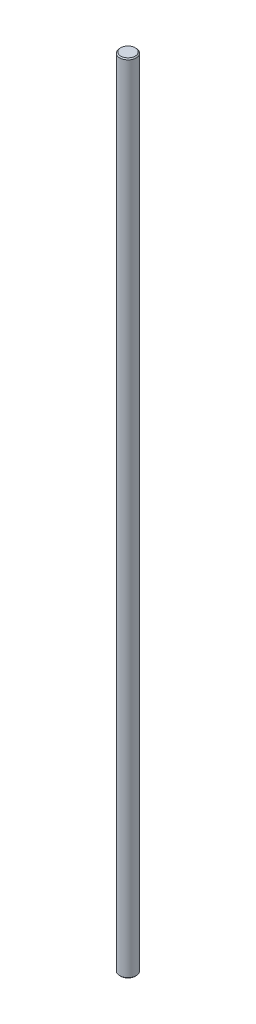
ISO-10303-21;
HEADER;
FILE_DESCRIPTION(('STEP AP214'),'2;1');
FILE_NAME('part.step','',(''),(''),'','','');
FILE_SCHEMA(('AUTOMOTIVE_DESIGN { 1 0 10303 214 1 1 1 1 }'));
ENDSEC;
DATA;
#1=APPLICATION_CONTEXT('core data for automotive mechanical design processes');
#2=APPLICATION_PROTOCOL_DEFINITION('international standard','automotive_design',2000,#1);
#3=PRODUCT_CONTEXT('',#1,'mechanical');
#4=PRODUCT('Part','Part','',(#3));
#5=PRODUCT_RELATED_PRODUCT_CATEGORY('part','',(#4));
#6=PRODUCT_DEFINITION_FORMATION('','',#4);
#7=PRODUCT_DEFINITION_CONTEXT('part definition',#1,'design');
#8=PRODUCT_DEFINITION('design','',#6,#7);
#9=PRODUCT_DEFINITION_SHAPE('','',#8);
#10=(LENGTH_UNIT() NAMED_UNIT(*) SI_UNIT(.MILLI.,.METRE.));
#11=(NAMED_UNIT(*) PLANE_ANGLE_UNIT() SI_UNIT($,.RADIAN.));
#12=(NAMED_UNIT(*) SI_UNIT($,.STERADIAN.) SOLID_ANGLE_UNIT());
#13=UNCERTAINTY_MEASURE_WITH_UNIT(LENGTH_MEASURE(1.E-05),#10,'distance_accuracy_value','');
#14=(GEOMETRIC_REPRESENTATION_CONTEXT(3) GLOBAL_UNCERTAINTY_ASSIGNED_CONTEXT((#13)) GLOBAL_UNIT_ASSIGNED_CONTEXT((#10,
#11,#12)) REPRESENTATION_CONTEXT('',''));
#15=CARTESIAN_POINT('',(0.,0.,0.));
#16=DIRECTION('',(0.,0.,1.));
#17=DIRECTION('',(1.,0.,0.));
#18=AXIS2_PLACEMENT_3D('',#15,#16,#17);
#19=CARTESIAN_POINT('',(0.,380.,0.));
#20=DIRECTION('',(0.,-1.,0.));
#21=DIRECTION('',(0.,0.,-1.));
#22=AXIS2_PLACEMENT_3D('',#19,#20,#21);
#23=CYLINDRICAL_SURFACE('',#22,3.95);
#24=CARTESIAN_POINT('',(0.,0.5,0.));
#25=DIRECTION('',(0.,1.,0.));
#26=DIRECTION('',(0.,0.,1.));
#27=AXIS2_PLACEMENT_3D('',#24,#25,#26);
#28=CIRCLE('',#27,3.95);
#29=CARTESIAN_POINT('',(0.,0.5,3.95));
#30=VERTEX_POINT('',#29);
#31=EDGE_CURVE('E39',#30,#30,#28,.T.);
#32=ORIENTED_EDGE('',*,*,#31,.T.);
#33=EDGE_LOOP('',(#32));
#34=FACE_BOUND('',#33,.T.);
#35=CARTESIAN_POINT('',(0.,379.5,0.));
#36=DIRECTION('',(0.,1.,0.));
#37=DIRECTION('',(0.,0.,1.));
#38=AXIS2_PLACEMENT_3D('',#35,#36,#37);
#39=CIRCLE('',#38,3.95);
#40=CARTESIAN_POINT('',(0.,379.5,3.95));
#41=VERTEX_POINT('',#40);
#42=EDGE_CURVE('E43',#41,#41,#39,.F.);
#43=ORIENTED_EDGE('',*,*,#42,.T.);
#44=EDGE_LOOP('',(#43));
#45=FACE_BOUND('',#44,.T.);
#46=ADVANCED_FACE('F32',(#34,#45),#23,.T.);
#47=CARTESIAN_POINT('',(0.,380.,0.));
#48=DIRECTION('',(0.,1.,0.));
#49=DIRECTION('',(0.,0.,1.));
#50=AXIS2_PLACEMENT_3D('',#47,#48,#49);
#51=PLANE('',#50);
#52=CARTESIAN_POINT('',(0.,380.,0.));
#53=DIRECTION('',(0.,1.,0.));
#54=DIRECTION('',(0.,0.,1.));
#55=AXIS2_PLACEMENT_3D('',#52,#53,#54);
#56=CIRCLE('',#55,3.45000000000001);
#57=CARTESIAN_POINT('',(0.,380.,3.45000000000001));
#58=VERTEX_POINT('',#57);
#59=EDGE_CURVE('E47',#58,#58,#56,.T.);
#60=ORIENTED_EDGE('',*,*,#59,.T.);
#61=EDGE_LOOP('',(#60));
#62=FACE_BOUND('',#61,.T.);
#63=ADVANCED_FACE('F53',(#62),#51,.T.);
#64=CARTESIAN_POINT('',(0.,0.,0.));
#65=DIRECTION('',(0.,1.,0.));
#66=DIRECTION('',(0.,0.,1.));
#67=AXIS2_PLACEMENT_3D('',#64,#65,#66);
#68=PLANE('',#67);
#69=CARTESIAN_POINT('',(0.,0.,0.));
#70=DIRECTION('',(0.,1.,0.));
#71=DIRECTION('',(0.,0.,1.));
#72=AXIS2_PLACEMENT_3D('',#69,#70,#71);
#73=CIRCLE('',#72,3.44999999999995);
#74=CARTESIAN_POINT('',(0.,0.,3.44999999999995));
#75=VERTEX_POINT('',#74);
#76=EDGE_CURVE('E10',#75,#75,#73,.F.);
#77=ORIENTED_EDGE('',*,*,#76,.T.);
#78=EDGE_LOOP('',(#77));
#79=FACE_BOUND('',#78,.T.);
#80=ADVANCED_FACE('F57',(#79),#68,.F.);
#81=CARTESIAN_POINT('',(0.,380.,0.));
#82=DIRECTION('',(0.,-1.,0.));
#83=DIRECTION('',(0.,0.,-1.));
#84=AXIS2_PLACEMENT_3D('',#81,#82,#83);
#85=CONICAL_SURFACE('',#84,3.45000000000001,0.78539816339744);
#86=ORIENTED_EDGE('',*,*,#42,.F.);
#87=EDGE_LOOP('',(#86));
#88=FACE_BOUND('',#87,.T.);
#89=ORIENTED_EDGE('',*,*,#59,.F.);
#90=EDGE_LOOP('',(#89));
#91=FACE_BOUND('',#90,.T.);
#92=ADVANCED_FACE('F55',(#88,#91),#85,.T.);
#93=CARTESIAN_POINT('',(0.,0.5,0.));
#94=DIRECTION('',(0.,1.,0.));
#95=DIRECTION('',(0.,0.,1.));
#96=AXIS2_PLACEMENT_3D('',#93,#94,#95);
#97=CONICAL_SURFACE('',#96,3.95,0.785398163397495);
#98=ORIENTED_EDGE('',*,*,#76,.F.);
#99=EDGE_LOOP('',(#98));
#100=FACE_BOUND('',#99,.T.);
#101=ORIENTED_EDGE('',*,*,#31,.F.);
#102=EDGE_LOOP('',(#101));
#103=FACE_BOUND('',#102,.T.);
#104=ADVANCED_FACE('F34',(#100,#103),#97,.T.);
#105=CLOSED_SHELL('',(#46,#63,#80,#92,#104));
#106=MANIFOLD_SOLID_BREP('B2',#105);
#107=ADVANCED_BREP_SHAPE_REPRESENTATION('',(#18,#106),#14);
#108=SHAPE_DEFINITION_REPRESENTATION(#9,#107);
ENDSEC;
END-ISO-10303-21;
